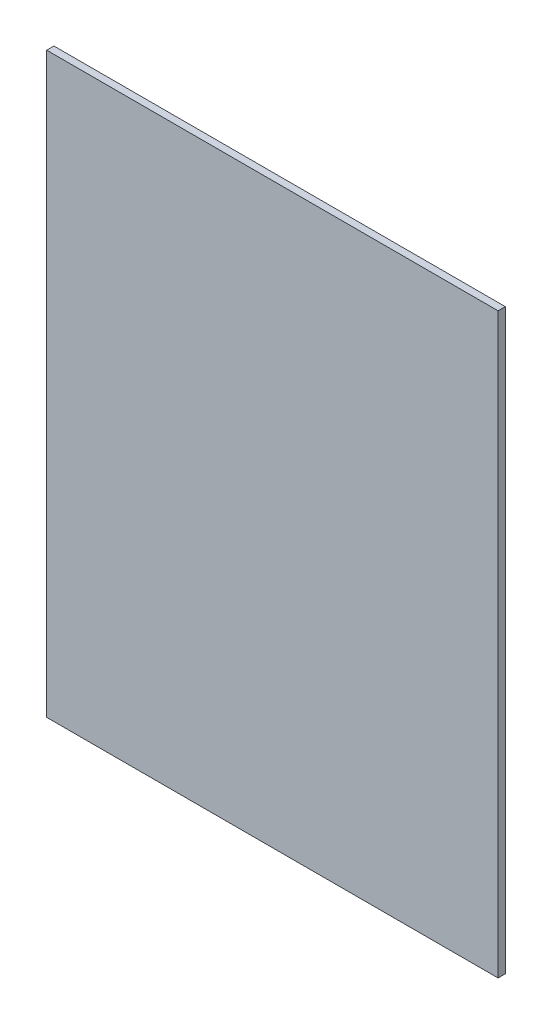
ISO-10303-21;
HEADER;
FILE_DESCRIPTION(('STEP AP214'),'2;1');
FILE_NAME('part.step','',(''),(''),'','','');
FILE_SCHEMA(('AUTOMOTIVE_DESIGN { 1 0 10303 214 1 1 1 1 }'));
ENDSEC;
DATA;
#1=APPLICATION_CONTEXT('core data for automotive mechanical design processes');
#2=APPLICATION_PROTOCOL_DEFINITION('international standard','automotive_design',2000,#1);
#3=PRODUCT_CONTEXT('',#1,'mechanical');
#4=PRODUCT('Part','Part','',(#3));
#5=PRODUCT_RELATED_PRODUCT_CATEGORY('part','',(#4));
#6=PRODUCT_DEFINITION_FORMATION('','',#4);
#7=PRODUCT_DEFINITION_CONTEXT('part definition',#1,'design');
#8=PRODUCT_DEFINITION('design','',#6,#7);
#9=PRODUCT_DEFINITION_SHAPE('','',#8);
#10=(LENGTH_UNIT() NAMED_UNIT(*) SI_UNIT(.MILLI.,.METRE.));
#11=(NAMED_UNIT(*) PLANE_ANGLE_UNIT() SI_UNIT($,.RADIAN.));
#12=(NAMED_UNIT(*) SI_UNIT($,.STERADIAN.) SOLID_ANGLE_UNIT());
#13=UNCERTAINTY_MEASURE_WITH_UNIT(LENGTH_MEASURE(1.E-05),#10,'distance_accuracy_value','');
#14=(GEOMETRIC_REPRESENTATION_CONTEXT(3) GLOBAL_UNCERTAINTY_ASSIGNED_CONTEXT((#13)) GLOBAL_UNIT_ASSIGNED_CONTEXT((#10,
#11,#12)) REPRESENTATION_CONTEXT('',''));
#15=CARTESIAN_POINT('',(0.,0.,0.));
#16=DIRECTION('',(0.,0.,1.));
#17=DIRECTION('',(1.,0.,0.));
#18=AXIS2_PLACEMENT_3D('',#15,#16,#17);
#19=CARTESIAN_POINT('',(105.,140.,-58.2249091517434));
#20=DIRECTION('',(0.,1.,0.));
#21=DIRECTION('',(0.,0.,1.));
#22=AXIS2_PLACEMENT_3D('',#19,#20,#21);
#23=PLANE('',#22);
#24=DIRECTION('',(-1.,0.,0.));
#25=VECTOR('',#24,1.);
#26=CARTESIAN_POINT('',(105.,140.,-54.2249091517434));
#27=LINE('',#26,#25);
#28=CARTESIAN_POINT('',(105.,140.,-54.2249091517434));
#29=VERTEX_POINT('',#28);
#30=CARTESIAN_POINT('',(-145.,140.,-54.2249091517434));
#31=VERTEX_POINT('',#30);
#32=EDGE_CURVE('E96',#29,#31,#27,.T.);
#33=ORIENTED_EDGE('',*,*,#32,.F.);
#34=DIRECTION('',(0.,0.,1.));
#35=VECTOR('',#34,1.);
#36=CARTESIAN_POINT('',(105.,140.,-58.2249091517434));
#37=LINE('',#36,#35);
#38=CARTESIAN_POINT('',(105.,140.,-58.2249091517434));
#39=VERTEX_POINT('',#38);
#40=EDGE_CURVE('E11',#39,#29,#37,.T.);
#41=ORIENTED_EDGE('',*,*,#40,.F.);
#42=DIRECTION('',(-1.,0.,0.));
#43=VECTOR('',#42,1.);
#44=CARTESIAN_POINT('',(105.,140.,-58.2249091517434));
#45=LINE('',#44,#43);
#46=CARTESIAN_POINT('',(-145.,140.,-58.2249091517434));
#47=VERTEX_POINT('',#46);
#48=EDGE_CURVE('E90',#39,#47,#45,.T.);
#49=ORIENTED_EDGE('',*,*,#48,.T.);
#50=DIRECTION('',(0.,0.,1.));
#51=VECTOR('',#50,1.);
#52=CARTESIAN_POINT('',(-145.,140.,-58.2249091517434));
#53=LINE('',#52,#51);
#54=EDGE_CURVE('E35',#47,#31,#53,.T.);
#55=ORIENTED_EDGE('',*,*,#54,.T.);
#56=EDGE_LOOP('',(#33,#41,#49,#55));
#57=FACE_BOUND('',#56,.T.);
#58=ADVANCED_FACE('F32',(#57),#23,.T.);
#59=CARTESIAN_POINT('',(105.,-180.,-58.2249091517434));
#60=DIRECTION('',(1.,0.,0.));
#61=DIRECTION('',(0.,0.,-1.));
#62=AXIS2_PLACEMENT_3D('',#59,#60,#61);
#63=PLANE('',#62);
#64=DIRECTION('',(0.,1.,0.));
#65=VECTOR('',#64,1.);
#66=CARTESIAN_POINT('',(105.,-180.,-54.2249091517434));
#67=LINE('',#66,#65);
#68=CARTESIAN_POINT('',(105.,-180.,-54.2249091517434));
#69=VERTEX_POINT('',#68);
#70=EDGE_CURVE('E92',#69,#29,#67,.T.);
#71=ORIENTED_EDGE('',*,*,#70,.F.);
#72=DIRECTION('',(0.,0.,1.));
#73=VECTOR('',#72,1.);
#74=CARTESIAN_POINT('',(105.,-180.,-58.2249091517434));
#75=LINE('',#74,#73);
#76=CARTESIAN_POINT('',(105.,-180.,-58.2249091517434));
#77=VERTEX_POINT('',#76);
#78=EDGE_CURVE('E41',#77,#69,#75,.T.);
#79=ORIENTED_EDGE('',*,*,#78,.F.);
#80=DIRECTION('',(0.,1.,0.));
#81=VECTOR('',#80,1.);
#82=CARTESIAN_POINT('',(105.,-180.,-58.2249091517434));
#83=LINE('',#82,#81);
#84=EDGE_CURVE('E87',#77,#39,#83,.T.);
#85=ORIENTED_EDGE('',*,*,#84,.T.);
#86=ORIENTED_EDGE('',*,*,#40,.T.);
#87=EDGE_LOOP('',(#71,#79,#85,#86));
#88=FACE_BOUND('',#87,.T.);
#89=ADVANCED_FACE('F106',(#88),#63,.T.);
#90=CARTESIAN_POINT('',(-145.,-180.,-58.2249091517434));
#91=DIRECTION('',(0.,-1.,0.));
#92=DIRECTION('',(0.,0.,-1.));
#93=AXIS2_PLACEMENT_3D('',#90,#91,#92);
#94=PLANE('',#93);
#95=DIRECTION('',(1.,0.,0.));
#96=VECTOR('',#95,1.);
#97=CARTESIAN_POINT('',(-145.,-180.,-54.2249091517434));
#98=LINE('',#97,#96);
#99=CARTESIAN_POINT('',(-145.,-180.,-54.2249091517434));
#100=VERTEX_POINT('',#99);
#101=EDGE_CURVE('E82',#100,#69,#98,.T.);
#102=ORIENTED_EDGE('',*,*,#101,.F.);
#103=DIRECTION('',(0.,0.,1.));
#104=VECTOR('',#103,1.);
#105=CARTESIAN_POINT('',(-145.,-180.,-58.2249091517434));
#106=LINE('',#105,#104);
#107=CARTESIAN_POINT('',(-145.,-180.,-58.2249091517434));
#108=VERTEX_POINT('',#107);
#109=EDGE_CURVE('E77',#108,#100,#106,.T.);
#110=ORIENTED_EDGE('',*,*,#109,.F.);
#111=DIRECTION('',(1.,0.,0.));
#112=VECTOR('',#111,1.);
#113=CARTESIAN_POINT('',(-145.,-180.,-58.2249091517434));
#114=LINE('',#113,#112);
#115=EDGE_CURVE('E80',#108,#77,#114,.T.);
#116=ORIENTED_EDGE('',*,*,#115,.T.);
#117=ORIENTED_EDGE('',*,*,#78,.T.);
#118=EDGE_LOOP('',(#102,#110,#116,#117));
#119=FACE_BOUND('',#118,.T.);
#120=ADVANCED_FACE('F79',(#119),#94,.T.);
#121=CARTESIAN_POINT('',(-145.,140.,-58.2249091517434));
#122=DIRECTION('',(-1.,0.,0.));
#123=DIRECTION('',(0.,-1.,0.));
#124=AXIS2_PLACEMENT_3D('',#121,#122,#123);
#125=PLANE('',#124);
#126=DIRECTION('',(0.,-1.,0.));
#127=VECTOR('',#126,1.);
#128=CARTESIAN_POINT('',(-145.,140.,-54.2249091517434));
#129=LINE('',#128,#127);
#130=EDGE_CURVE('E99',#31,#100,#129,.T.);
#131=ORIENTED_EDGE('',*,*,#130,.F.);
#132=ORIENTED_EDGE('',*,*,#54,.F.);
#133=DIRECTION('',(0.,-1.,0.));
#134=VECTOR('',#133,1.);
#135=CARTESIAN_POINT('',(-145.,140.,-58.2249091517434));
#136=LINE('',#135,#134);
#137=EDGE_CURVE('E86',#47,#108,#136,.T.);
#138=ORIENTED_EDGE('',*,*,#137,.T.);
#139=ORIENTED_EDGE('',*,*,#109,.T.);
#140=EDGE_LOOP('',(#131,#132,#138,#139));
#141=FACE_BOUND('',#140,.T.);
#142=ADVANCED_FACE('F89',(#141),#125,.T.);
#143=CARTESIAN_POINT('',(0.,0.,-58.2249091517434));
#144=DIRECTION('',(0.,0.,1.));
#145=DIRECTION('',(1.,0.,0.));
#146=AXIS2_PLACEMENT_3D('',#143,#144,#145);
#147=PLANE('',#146);
#148=ORIENTED_EDGE('',*,*,#48,.F.);
#149=ORIENTED_EDGE('',*,*,#84,.F.);
#150=ORIENTED_EDGE('',*,*,#115,.F.);
#151=ORIENTED_EDGE('',*,*,#137,.F.);
#152=EDGE_LOOP('',(#148,#149,#150,#151));
#153=FACE_BOUND('',#152,.T.);
#154=ADVANCED_FACE('F85',(#153),#147,.F.);
#155=CARTESIAN_POINT('',(0.,0.,-54.2249091517434));
#156=DIRECTION('',(0.,0.,1.));
#157=DIRECTION('',(1.,0.,0.));
#158=AXIS2_PLACEMENT_3D('',#155,#156,#157);
#159=PLANE('',#158);
#160=ORIENTED_EDGE('',*,*,#32,.T.);
#161=ORIENTED_EDGE('',*,*,#130,.T.);
#162=ORIENTED_EDGE('',*,*,#101,.T.);
#163=ORIENTED_EDGE('',*,*,#70,.T.);
#164=EDGE_LOOP('',(#160,#161,#162,#163));
#165=FACE_BOUND('',#164,.T.);
#166=ADVANCED_FACE('F105',(#165),#159,.T.);
#167=CLOSED_SHELL('',(#58,#89,#120,#142,#154,#166));
#168=MANIFOLD_SOLID_BREP('B2',#167);
#169=ADVANCED_BREP_SHAPE_REPRESENTATION('',(#18,#168),#14);
#170=SHAPE_DEFINITION_REPRESENTATION(#9,#169);
ENDSEC;
END-ISO-10303-21;
